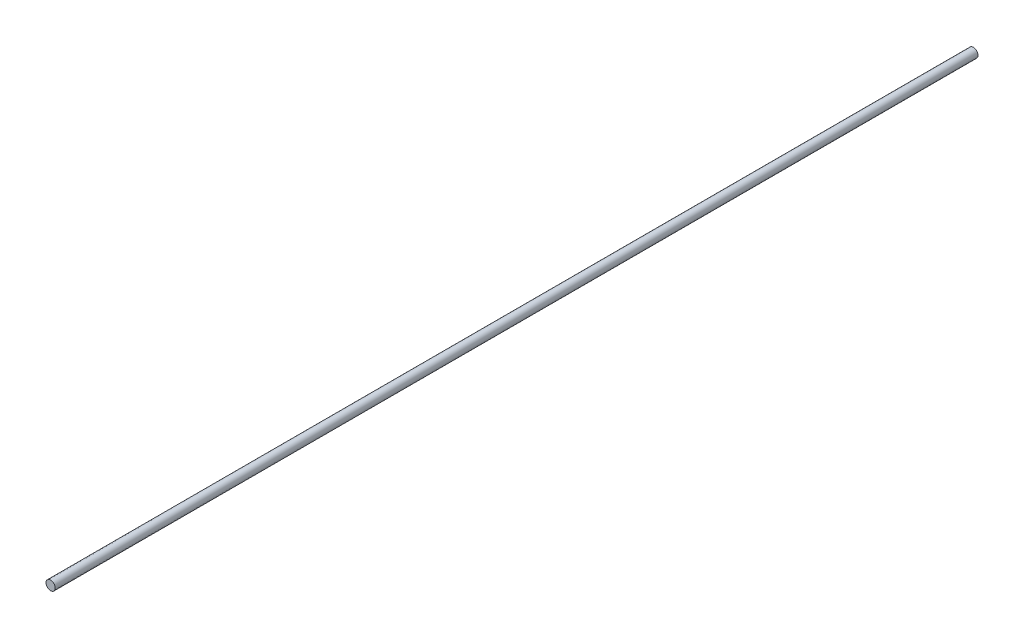
ISO-10303-21;
HEADER;
FILE_DESCRIPTION(('STEP AP214'),'2;1');
FILE_NAME('part.step','',(''),(''),'','','');
FILE_SCHEMA(('AUTOMOTIVE_DESIGN { 1 0 10303 214 1 1 1 1 }'));
ENDSEC;
DATA;
#1=APPLICATION_CONTEXT('core data for automotive mechanical design processes');
#2=APPLICATION_PROTOCOL_DEFINITION('international standard','automotive_design',2000,#1);
#3=PRODUCT_CONTEXT('',#1,'mechanical');
#4=PRODUCT('Part','Part','',(#3));
#5=PRODUCT_RELATED_PRODUCT_CATEGORY('part','',(#4));
#6=PRODUCT_DEFINITION_FORMATION('','',#4);
#7=PRODUCT_DEFINITION_CONTEXT('part definition',#1,'design');
#8=PRODUCT_DEFINITION('design','',#6,#7);
#9=PRODUCT_DEFINITION_SHAPE('','',#8);
#10=(LENGTH_UNIT() NAMED_UNIT(*) SI_UNIT(.MILLI.,.METRE.));
#11=(NAMED_UNIT(*) PLANE_ANGLE_UNIT() SI_UNIT($,.RADIAN.));
#12=(NAMED_UNIT(*) SI_UNIT($,.STERADIAN.) SOLID_ANGLE_UNIT());
#13=UNCERTAINTY_MEASURE_WITH_UNIT(LENGTH_MEASURE(1.E-05),#10,'distance_accuracy_value','');
#14=(GEOMETRIC_REPRESENTATION_CONTEXT(3) GLOBAL_UNCERTAINTY_ASSIGNED_CONTEXT((#13)) GLOBAL_UNIT_ASSIGNED_CONTEXT((#10,
#11,#12)) REPRESENTATION_CONTEXT('',''));
#15=CARTESIAN_POINT('',(0.,0.,0.));
#16=DIRECTION('',(0.,0.,1.));
#17=DIRECTION('',(1.,0.,0.));
#18=AXIS2_PLACEMENT_3D('',#15,#16,#17);
#19=CARTESIAN_POINT('',(0.,0.,800.));
#20=DIRECTION('',(0.,0.,-1.));
#21=DIRECTION('',(-1.,0.,0.));
#22=AXIS2_PLACEMENT_3D('',#19,#20,#21);
#23=CYLINDRICAL_SURFACE('',#22,4.);
#24=CARTESIAN_POINT('',(0.,0.,800.));
#25=DIRECTION('',(0.,0.,1.));
#26=DIRECTION('',(1.,0.,0.));
#27=AXIS2_PLACEMENT_3D('',#24,#25,#26);
#28=CIRCLE('',#27,4.);
#29=CARTESIAN_POINT('',(4.,0.,800.));
#30=VERTEX_POINT('',#29);
#31=EDGE_CURVE('E10',#30,#30,#28,.T.);
#32=ORIENTED_EDGE('',*,*,#31,.F.);
#33=EDGE_LOOP('',(#32));
#34=FACE_BOUND('',#33,.T.);
#35=CARTESIAN_POINT('',(0.,0.,0.));
#36=DIRECTION('',(0.,0.,1.));
#37=DIRECTION('',(1.,0.,0.));
#38=AXIS2_PLACEMENT_3D('',#35,#36,#37);
#39=CIRCLE('',#38,4.);
#40=CARTESIAN_POINT('',(4.,0.,0.));
#41=VERTEX_POINT('',#40);
#42=EDGE_CURVE('E42',#41,#41,#39,.T.);
#43=ORIENTED_EDGE('',*,*,#42,.T.);
#44=EDGE_LOOP('',(#43));
#45=FACE_BOUND('',#44,.T.);
#46=ADVANCED_FACE('F39',(#34,#45),#23,.T.);
#47=CARTESIAN_POINT('',(0.,0.,800.));
#48=DIRECTION('',(0.,0.,1.));
#49=DIRECTION('',(1.,0.,0.));
#50=AXIS2_PLACEMENT_3D('',#47,#48,#49);
#51=PLANE('',#50);
#52=ORIENTED_EDGE('',*,*,#31,.T.);
#53=EDGE_LOOP('',(#52));
#54=FACE_BOUND('',#53,.T.);
#55=ADVANCED_FACE('F54',(#54),#51,.T.);
#56=CARTESIAN_POINT('',(0.,0.,0.));
#57=DIRECTION('',(0.,0.,1.));
#58=DIRECTION('',(1.,0.,0.));
#59=AXIS2_PLACEMENT_3D('',#56,#57,#58);
#60=PLANE('',#59);
#61=ORIENTED_EDGE('',*,*,#42,.F.);
#62=EDGE_LOOP('',(#61));
#63=FACE_BOUND('',#62,.T.);
#64=ADVANCED_FACE('F52',(#63),#60,.F.);
#65=CLOSED_SHELL('',(#46,#55,#64));
#66=MANIFOLD_SOLID_BREP('B2',#65);
#67=ADVANCED_BREP_SHAPE_REPRESENTATION('',(#18,#66),#14);
#68=SHAPE_DEFINITION_REPRESENTATION(#9,#67);
ENDSEC;
END-ISO-10303-21;
